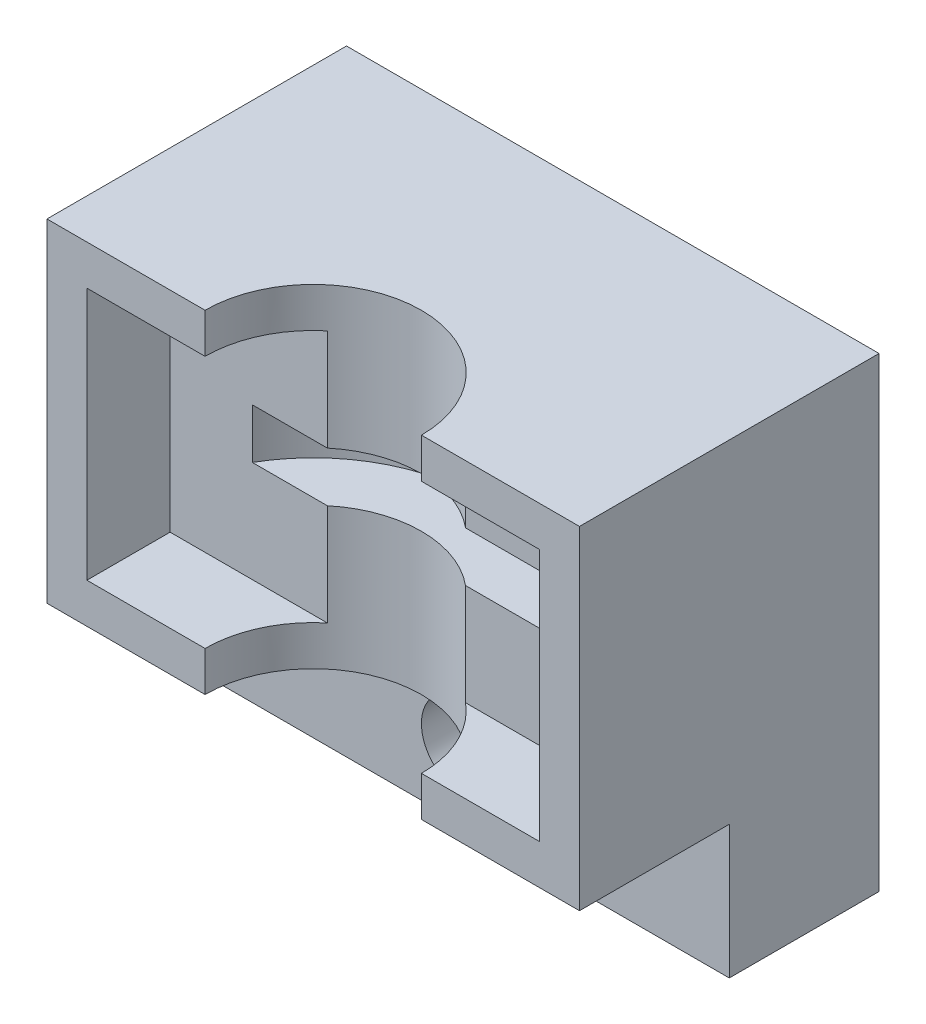
ISO-10303-21;
HEADER;
FILE_DESCRIPTION(('STEP AP214'),'2;1');
FILE_NAME('part.step','',(''),(''),'','','');
FILE_SCHEMA(('AUTOMOTIVE_DESIGN { 1 0 10303 214 1 1 1 1 }'));
ENDSEC;
DATA;
#1=APPLICATION_CONTEXT('core data for automotive mechanical design processes');
#2=APPLICATION_PROTOCOL_DEFINITION('international standard','automotive_design',2000,#1);
#3=PRODUCT_CONTEXT('',#1,'mechanical');
#4=PRODUCT('Part','Part','',(#3));
#5=PRODUCT_RELATED_PRODUCT_CATEGORY('part','',(#4));
#6=PRODUCT_DEFINITION_FORMATION('','',#4);
#7=PRODUCT_DEFINITION_CONTEXT('part definition',#1,'design');
#8=PRODUCT_DEFINITION('design','',#6,#7);
#9=PRODUCT_DEFINITION_SHAPE('','',#8);
#10=(LENGTH_UNIT() NAMED_UNIT(*) SI_UNIT(.MILLI.,.METRE.));
#11=(NAMED_UNIT(*) PLANE_ANGLE_UNIT() SI_UNIT($,.RADIAN.));
#12=(NAMED_UNIT(*) SI_UNIT($,.STERADIAN.) SOLID_ANGLE_UNIT());
#13=UNCERTAINTY_MEASURE_WITH_UNIT(LENGTH_MEASURE(1.E-05),#10,'distance_accuracy_value','');
#14=(GEOMETRIC_REPRESENTATION_CONTEXT(3) GLOBAL_UNCERTAINTY_ASSIGNED_CONTEXT((#13)) GLOBAL_UNIT_ASSIGNED_CONTEXT((#10,
#11,#12)) REPRESENTATION_CONTEXT('',''));
#15=CARTESIAN_POINT('',(0.,0.,0.));
#16=DIRECTION('',(0.,0.,1.));
#17=DIRECTION('',(1.,0.,0.));
#18=AXIS2_PLACEMENT_3D('',#15,#16,#17);
#19=CARTESIAN_POINT('',(0.,0.,90.));
#20=DIRECTION('',(0.,0.,1.));
#21=DIRECTION('',(1.,0.,0.));
#22=AXIS2_PLACEMENT_3D('',#19,#20,#21);
#23=PLANE('',#22);
#24=DIRECTION('',(-1.,0.,0.));
#25=VECTOR('',#24,1.);
#26=CARTESIAN_POINT('',(68.,58.,90.));
#27=LINE('',#26,#25);
#28=CARTESIAN_POINT('',(-32.5,58.,90.));
#29=VERTEX_POINT('',#28);
#30=CARTESIAN_POINT('',(-68.,58.,90.));
#31=VERTEX_POINT('',#30);
#32=EDGE_CURVE('E197',#29,#31,#27,.T.);
#33=ORIENTED_EDGE('',*,*,#32,.F.);
#34=DIRECTION('',(0.,-1.,0.));
#35=VECTOR('',#34,1.);
#36=CARTESIAN_POINT('',(-32.5,70.,90.));
#37=LINE('',#36,#35);
#38=CARTESIAN_POINT('',(-32.5,70.,90.));
#39=VERTEX_POINT('',#38);
#40=EDGE_CURVE('E292',#39,#29,#37,.T.);
#41=ORIENTED_EDGE('',*,*,#40,.F.);
#42=DIRECTION('',(-1.,0.,0.));
#43=VECTOR('',#42,1.);
#44=CARTESIAN_POINT('',(-80.,70.,90.));
#45=LINE('',#44,#43);
#46=CARTESIAN_POINT('',(-80.,70.,90.));
#47=VERTEX_POINT('',#46);
#48=EDGE_CURVE('E262',#39,#47,#45,.T.);
#49=ORIENTED_EDGE('',*,*,#48,.T.);
#50=DIRECTION('',(0.,-1.,0.));
#51=VECTOR('',#50,1.);
#52=CARTESIAN_POINT('',(-80.,70.,90.));
#53=LINE('',#52,#51);
#54=CARTESIAN_POINT('',(-80.,-30.,90.));
#55=VERTEX_POINT('',#54);
#56=EDGE_CURVE('E252',#47,#55,#53,.T.);
#57=ORIENTED_EDGE('',*,*,#56,.T.);
#58=DIRECTION('',(1.,0.,0.));
#59=VECTOR('',#58,1.);
#60=CARTESIAN_POINT('',(-80.,-30.,90.));
#61=LINE('',#60,#59);
#62=CARTESIAN_POINT('',(-32.5,-30.,90.));
#63=VERTEX_POINT('',#62);
#64=EDGE_CURVE('E256',#55,#63,#61,.T.);
#65=ORIENTED_EDGE('',*,*,#64,.T.);
#66=CARTESIAN_POINT('',(-32.5,-18.,90.));
#67=VERTEX_POINT('',#66);
#68=EDGE_CURVE('E290',#67,#63,#37,.T.);
#69=ORIENTED_EDGE('',*,*,#68,.F.);
#70=DIRECTION('',(1.,0.,0.));
#71=VECTOR('',#70,1.);
#72=CARTESIAN_POINT('',(68.,-18.,90.));
#73=LINE('',#72,#71);
#74=CARTESIAN_POINT('',(-68.,-18.,90.));
#75=VERTEX_POINT('',#74);
#76=EDGE_CURVE('E206',#75,#67,#73,.T.);
#77=ORIENTED_EDGE('',*,*,#76,.F.);
#78=DIRECTION('',(0.,-1.,0.));
#79=VECTOR('',#78,1.);
#80=CARTESIAN_POINT('',(-68.,58.,90.));
#81=LINE('',#80,#79);
#82=EDGE_CURVE('E178',#31,#75,#81,.T.);
#83=ORIENTED_EDGE('',*,*,#82,.F.);
#84=EDGE_LOOP('',(#33,#41,#49,#57,#65,#69,#77,#83));
#85=FACE_BOUND('',#84,.T.);
#86=ADVANCED_FACE('F33',(#85),#23,.T.);
#87=CARTESIAN_POINT('',(68.,58.,90.));
#88=VERTEX_POINT('',#87);
#89=CARTESIAN_POINT('',(32.5,58.,90.));
#90=VERTEX_POINT('',#89);
#91=EDGE_CURVE('E195',#88,#90,#27,.T.);
#92=ORIENTED_EDGE('',*,*,#91,.F.);
#93=DIRECTION('',(0.,1.,0.));
#94=VECTOR('',#93,1.);
#95=CARTESIAN_POINT('',(68.,58.,90.));
#96=LINE('',#95,#94);
#97=CARTESIAN_POINT('',(68.,-18.,90.));
#98=VERTEX_POINT('',#97);
#99=EDGE_CURVE('E208',#98,#88,#96,.T.);
#100=ORIENTED_EDGE('',*,*,#99,.F.);
#101=CARTESIAN_POINT('',(32.5,-18.,90.));
#102=VERTEX_POINT('',#101);
#103=EDGE_CURVE('E205',#102,#98,#73,.T.);
#104=ORIENTED_EDGE('',*,*,#103,.F.);
#105=DIRECTION('',(0.,-1.,0.));
#106=VECTOR('',#105,1.);
#107=CARTESIAN_POINT('',(32.5,70.,90.));
#108=LINE('',#107,#106);
#109=CARTESIAN_POINT('',(32.5,-30.,90.));
#110=VERTEX_POINT('',#109);
#111=EDGE_CURVE('E287',#110,#102,#108,.F.);
#112=ORIENTED_EDGE('',*,*,#111,.F.);
#113=CARTESIAN_POINT('',(80.,-30.,90.));
#114=VERTEX_POINT('',#113);
#115=EDGE_CURVE('E255',#110,#114,#61,.T.);
#116=ORIENTED_EDGE('',*,*,#115,.T.);
#117=DIRECTION('',(0.,1.,0.));
#118=VECTOR('',#117,1.);
#119=CARTESIAN_POINT('',(80.,70.,90.));
#120=LINE('',#119,#118);
#121=CARTESIAN_POINT('',(80.,70.,90.));
#122=VERTEX_POINT('',#121);
#123=EDGE_CURVE('E259',#114,#122,#120,.T.);
#124=ORIENTED_EDGE('',*,*,#123,.T.);
#125=CARTESIAN_POINT('',(32.5,70.,90.));
#126=VERTEX_POINT('',#125);
#127=EDGE_CURVE('E263',#122,#126,#45,.T.);
#128=ORIENTED_EDGE('',*,*,#127,.T.);
#129=EDGE_CURVE('E291',#90,#126,#108,.F.);
#130=ORIENTED_EDGE('',*,*,#129,.F.);
#131=EDGE_LOOP('',(#92,#100,#104,#112,#116,#124,#128,#130));
#132=FACE_BOUND('',#131,.T.);
#133=ADVANCED_FACE('F331',(#132),#23,.T.);
#134=CARTESIAN_POINT('',(0.,70.,90.));
#135=DIRECTION('',(0.,-1.,0.));
#136=DIRECTION('',(0.,0.,-1.));
#137=AXIS2_PLACEMENT_3D('',#134,#135,#136);
#138=CYLINDRICAL_SURFACE('',#137,32.5);
#139=DIRECTION('',(0.,-1.,0.));
#140=VECTOR('',#139,1.);
#141=CARTESIAN_POINT('',(20.7665596572952,70.,65.));
#142=LINE('',#141,#140);
#143=CARTESIAN_POINT('',(20.7665596572952,27.5,65.));
#144=VERTEX_POINT('',#143);
#145=CARTESIAN_POINT('',(20.7665596572952,58.,65.));
#146=VERTEX_POINT('',#145);
#147=EDGE_CURVE('E223',#144,#146,#142,.F.);
#148=ORIENTED_EDGE('',*,*,#147,.T.);
#149=CARTESIAN_POINT('',(0.,58.,90.));
#150=DIRECTION('',(0.,1.,0.));
#151=DIRECTION('',(0.,0.,1.));
#152=AXIS2_PLACEMENT_3D('',#149,#150,#151);
#153=CIRCLE('',#152,32.5);
#154=EDGE_CURVE('E11',#146,#90,#153,.F.);
#155=ORIENTED_EDGE('',*,*,#154,.T.);
#156=ORIENTED_EDGE('',*,*,#129,.T.);
#157=CARTESIAN_POINT('',(0.,70.,90.));
#158=DIRECTION('',(0.,-1.,0.));
#159=DIRECTION('',(0.,0.,-1.));
#160=AXIS2_PLACEMENT_3D('',#157,#158,#159);
#161=CIRCLE('',#160,32.5);
#162=EDGE_CURVE('E241',#39,#126,#161,.T.);
#163=ORIENTED_EDGE('',*,*,#162,.F.);
#164=ORIENTED_EDGE('',*,*,#40,.T.);
#165=CARTESIAN_POINT('',(-20.7665596572952,58.,65.));
#166=VERTEX_POINT('',#165);
#167=EDGE_CURVE('E37',#29,#166,#153,.F.);
#168=ORIENTED_EDGE('',*,*,#167,.T.);
#169=DIRECTION('',(0.,-1.,0.));
#170=VECTOR('',#169,1.);
#171=CARTESIAN_POINT('',(-20.7665596572952,70.,65.));
#172=LINE('',#171,#170);
#173=CARTESIAN_POINT('',(-20.7665596572952,27.5,65.));
#174=VERTEX_POINT('',#173);
#175=EDGE_CURVE('E231',#166,#174,#172,.T.);
#176=ORIENTED_EDGE('',*,*,#175,.T.);
#177=CARTESIAN_POINT('',(0.,27.5,90.));
#178=DIRECTION('',(0.,-1.,0.));
#179=DIRECTION('',(0.,0.,-1.));
#180=AXIS2_PLACEMENT_3D('',#177,#178,#179);
#181=CIRCLE('',#180,32.5);
#182=EDGE_CURVE('E298',#144,#174,#181,.F.);
#183=ORIENTED_EDGE('',*,*,#182,.F.);
#184=EDGE_LOOP('',(#148,#155,#156,#163,#164,#168,#176,#183));
#185=FACE_BOUND('',#184,.T.);
#186=ADVANCED_FACE('F328',(#185),#138,.F.);
#187=CARTESIAN_POINT('',(0.,0.,45.));
#188=DIRECTION('',(0.,0.,-1.));
#189=DIRECTION('',(-1.,0.,0.));
#190=AXIS2_PLACEMENT_3D('',#187,#188,#189);
#191=PLANE('',#190);
#192=CARTESIAN_POINT('',(0.,-50.,45.));
#193=DIRECTION('',(0.,0.,1.));
#194=DIRECTION('',(1.,0.,0.));
#195=AXIS2_PLACEMENT_3D('',#192,#193,#194);
#196=CIRCLE('',#195,12.5);
#197=CARTESIAN_POINT('',(12.5,-50.,45.));
#198=VERTEX_POINT('',#197);
#199=EDGE_CURVE('E244',#198,#198,#196,.T.);
#200=ORIENTED_EDGE('',*,*,#199,.F.);
#201=EDGE_LOOP('',(#200));
#202=FACE_BOUND('',#201,.T.);
#203=DIRECTION('',(1.,0.,0.));
#204=VECTOR('',#203,1.);
#205=CARTESIAN_POINT('',(-80.,-30.,45.));
#206=LINE('',#205,#204);
#207=CARTESIAN_POINT('',(-80.,-30.,45.));
#208=VERTEX_POINT('',#207);
#209=CARTESIAN_POINT('',(80.,-30.,45.));
#210=VERTEX_POINT('',#209);
#211=EDGE_CURVE('E249',#208,#210,#206,.T.);
#212=ORIENTED_EDGE('',*,*,#211,.F.);
#213=DIRECTION('',(0.,-1.,0.));
#214=VECTOR('',#213,1.);
#215=CARTESIAN_POINT('',(-80.,-70.,45.));
#216=LINE('',#215,#214);
#217=CARTESIAN_POINT('',(-80.,-70.,45.));
#218=VERTEX_POINT('',#217);
#219=EDGE_CURVE('E275',#208,#218,#216,.T.);
#220=ORIENTED_EDGE('',*,*,#219,.T.);
#221=DIRECTION('',(1.,0.,0.));
#222=VECTOR('',#221,1.);
#223=CARTESIAN_POINT('',(-80.,-70.,45.));
#224=LINE('',#223,#222);
#225=CARTESIAN_POINT('',(80.,-70.,45.));
#226=VERTEX_POINT('',#225);
#227=EDGE_CURVE('E347',#218,#226,#224,.T.);
#228=ORIENTED_EDGE('',*,*,#227,.T.);
#229=DIRECTION('',(0.,1.,0.));
#230=VECTOR('',#229,1.);
#231=CARTESIAN_POINT('',(80.,-70.,45.));
#232=LINE('',#231,#230);
#233=EDGE_CURVE('E343',#226,#210,#232,.T.);
#234=ORIENTED_EDGE('',*,*,#233,.T.);
#235=EDGE_LOOP('',(#212,#220,#228,#234));
#236=FACE_BOUND('',#235,.T.);
#237=ADVANCED_FACE('F373',(#202,#236),#191,.F.);
#238=CARTESIAN_POINT('',(80.,-70.,45.));
#239=DIRECTION('',(-1.,0.,0.));
#240=DIRECTION('',(0.,0.,1.));
#241=AXIS2_PLACEMENT_3D('',#238,#239,#240);
#242=PLANE('',#241);
#243=DIRECTION('',(0.,1.,0.));
#244=VECTOR('',#243,1.);
#245=CARTESIAN_POINT('',(80.,-70.,0.));
#246=LINE('',#245,#244);
#247=CARTESIAN_POINT('',(80.,-70.,0.));
#248=VERTEX_POINT('',#247);
#249=CARTESIAN_POINT('',(80.,70.,0.));
#250=VERTEX_POINT('',#249);
#251=EDGE_CURVE('E284',#248,#250,#246,.T.);
#252=ORIENTED_EDGE('',*,*,#251,.T.);
#253=DIRECTION('',(0.,0.,-1.));
#254=VECTOR('',#253,1.);
#255=CARTESIAN_POINT('',(80.,70.,45.));
#256=LINE('',#255,#254);
#257=EDGE_CURVE('E333',#122,#250,#256,.T.);
#258=ORIENTED_EDGE('',*,*,#257,.F.);
#259=ORIENTED_EDGE('',*,*,#123,.F.);
#260=DIRECTION('',(0.,0.,-1.));
#261=VECTOR('',#260,1.);
#262=CARTESIAN_POINT('',(80.,-30.,90.));
#263=LINE('',#262,#261);
#264=EDGE_CURVE('E266',#114,#210,#263,.T.);
#265=ORIENTED_EDGE('',*,*,#264,.T.);
#266=ORIENTED_EDGE('',*,*,#233,.F.);
#267=DIRECTION('',(0.,0.,-1.));
#268=VECTOR('',#267,1.);
#269=CARTESIAN_POINT('',(80.,-70.,45.));
#270=LINE('',#269,#268);
#271=EDGE_CURVE('E359',#226,#248,#270,.T.);
#272=ORIENTED_EDGE('',*,*,#271,.T.);
#273=EDGE_LOOP('',(#252,#258,#259,#265,#266,#272));
#274=FACE_BOUND('',#273,.T.);
#275=ADVANCED_FACE('F35',(#274),#242,.F.);
#276=CARTESIAN_POINT('',(-80.,70.,45.));
#277=DIRECTION('',(0.,-1.,0.));
#278=DIRECTION('',(0.,0.,-1.));
#279=AXIS2_PLACEMENT_3D('',#276,#277,#278);
#280=PLANE('',#279);
#281=ORIENTED_EDGE('',*,*,#48,.F.);
#282=ORIENTED_EDGE('',*,*,#162,.T.);
#283=ORIENTED_EDGE('',*,*,#127,.F.);
#284=ORIENTED_EDGE('',*,*,#257,.T.);
#285=DIRECTION('',(-1.,0.,0.));
#286=VECTOR('',#285,1.);
#287=CARTESIAN_POINT('',(-80.,70.,0.));
#288=LINE('',#287,#286);
#289=CARTESIAN_POINT('',(-80.,70.,0.));
#290=VERTEX_POINT('',#289);
#291=EDGE_CURVE('E355',#250,#290,#288,.T.);
#292=ORIENTED_EDGE('',*,*,#291,.T.);
#293=DIRECTION('',(0.,0.,-1.));
#294=VECTOR('',#293,1.);
#295=CARTESIAN_POINT('',(-80.,70.,45.));
#296=LINE('',#295,#294);
#297=EDGE_CURVE('E335',#47,#290,#296,.T.);
#298=ORIENTED_EDGE('',*,*,#297,.F.);
#299=EDGE_LOOP('',(#281,#282,#283,#284,#292,#298));
#300=FACE_BOUND('',#299,.T.);
#301=ADVANCED_FACE('F388',(#300),#280,.F.);
#302=CARTESIAN_POINT('',(-80.,-70.,45.));
#303=DIRECTION('',(1.,0.,0.));
#304=DIRECTION('',(0.,0.,-1.));
#305=AXIS2_PLACEMENT_3D('',#302,#303,#304);
#306=PLANE('',#305);
#307=DIRECTION('',(0.,-1.,0.));
#308=VECTOR('',#307,1.);
#309=CARTESIAN_POINT('',(-80.,-70.,0.));
#310=LINE('',#309,#308);
#311=CARTESIAN_POINT('',(-80.,-70.,0.));
#312=VERTEX_POINT('',#311);
#313=EDGE_CURVE('E348',#290,#312,#310,.T.);
#314=ORIENTED_EDGE('',*,*,#313,.T.);
#315=DIRECTION('',(0.,0.,-1.));
#316=VECTOR('',#315,1.);
#317=CARTESIAN_POINT('',(-80.,-70.,45.));
#318=LINE('',#317,#316);
#319=EDGE_CURVE('E340',#218,#312,#318,.T.);
#320=ORIENTED_EDGE('',*,*,#319,.F.);
#321=ORIENTED_EDGE('',*,*,#219,.F.);
#322=DIRECTION('',(0.,0.,-1.));
#323=VECTOR('',#322,1.);
#324=CARTESIAN_POINT('',(-80.,-30.,90.));
#325=LINE('',#324,#323);
#326=EDGE_CURVE('E279',#55,#208,#325,.T.);
#327=ORIENTED_EDGE('',*,*,#326,.F.);
#328=ORIENTED_EDGE('',*,*,#56,.F.);
#329=ORIENTED_EDGE('',*,*,#297,.T.);
#330=EDGE_LOOP('',(#314,#320,#321,#327,#328,#329));
#331=FACE_BOUND('',#330,.T.);
#332=ADVANCED_FACE('F381',(#331),#306,.F.);
#333=CARTESIAN_POINT('',(-80.,-70.,45.));
#334=DIRECTION('',(0.,1.,0.));
#335=DIRECTION('',(0.,0.,1.));
#336=AXIS2_PLACEMENT_3D('',#333,#334,#335);
#337=PLANE('',#336);
#338=DIRECTION('',(1.,0.,0.));
#339=VECTOR('',#338,1.);
#340=CARTESIAN_POINT('',(-80.,-70.,0.));
#341=LINE('',#340,#339);
#342=EDGE_CURVE('E344',#312,#248,#341,.T.);
#343=ORIENTED_EDGE('',*,*,#342,.T.);
#344=ORIENTED_EDGE('',*,*,#271,.F.);
#345=ORIENTED_EDGE('',*,*,#227,.F.);
#346=ORIENTED_EDGE('',*,*,#319,.T.);
#347=EDGE_LOOP('',(#343,#344,#345,#346));
#348=FACE_BOUND('',#347,.T.);
#349=ADVANCED_FACE('F362',(#348),#337,.F.);
#350=CARTESIAN_POINT('',(0.,0.,0.));
#351=DIRECTION('',(0.,0.,-1.));
#352=DIRECTION('',(-1.,0.,0.));
#353=AXIS2_PLACEMENT_3D('',#350,#351,#352);
#354=PLANE('',#353);
#355=CARTESIAN_POINT('',(0.,-50.,0.));
#356=DIRECTION('',(0.,0.,1.));
#357=DIRECTION('',(1.,0.,0.));
#358=AXIS2_PLACEMENT_3D('',#355,#356,#357);
#359=CIRCLE('',#358,12.5);
#360=CARTESIAN_POINT('',(12.5,-50.,0.));
#361=VERTEX_POINT('',#360);
#362=EDGE_CURVE('E246',#361,#361,#359,.T.);
#363=ORIENTED_EDGE('',*,*,#362,.T.);
#364=EDGE_LOOP('',(#363));
#365=FACE_BOUND('',#364,.T.);
#366=ORIENTED_EDGE('',*,*,#251,.F.);
#367=ORIENTED_EDGE('',*,*,#342,.F.);
#368=ORIENTED_EDGE('',*,*,#313,.F.);
#369=ORIENTED_EDGE('',*,*,#291,.F.);
#370=EDGE_LOOP('',(#366,#367,#368,#369));
#371=FACE_BOUND('',#370,.T.);
#372=ADVANCED_FACE('F368',(#365,#371),#354,.T.);
#373=CARTESIAN_POINT('',(-80.,-30.,90.));
#374=DIRECTION('',(0.,1.,0.));
#375=DIRECTION('',(0.,0.,1.));
#376=AXIS2_PLACEMENT_3D('',#373,#374,#375);
#377=PLANE('',#376);
#378=ORIENTED_EDGE('',*,*,#115,.F.);
#379=CARTESIAN_POINT('',(0.,-30.,90.));
#380=DIRECTION('',(0.,-1.,0.));
#381=DIRECTION('',(0.,0.,-1.));
#382=AXIS2_PLACEMENT_3D('',#379,#380,#381);
#383=CIRCLE('',#382,32.5);
#384=EDGE_CURVE('E238',#63,#110,#383,.T.);
#385=ORIENTED_EDGE('',*,*,#384,.F.);
#386=ORIENTED_EDGE('',*,*,#64,.F.);
#387=ORIENTED_EDGE('',*,*,#326,.T.);
#388=ORIENTED_EDGE('',*,*,#211,.T.);
#389=ORIENTED_EDGE('',*,*,#264,.F.);
#390=EDGE_LOOP('',(#378,#385,#386,#387,#388,#389));
#391=FACE_BOUND('',#390,.T.);
#392=ADVANCED_FACE('F378',(#391),#377,.F.);
#393=CARTESIAN_POINT('',(0.,-50.,0.));
#394=DIRECTION('',(0.,0.,1.));
#395=DIRECTION('',(1.,0.,0.));
#396=AXIS2_PLACEMENT_3D('',#393,#394,#395);
#397=CYLINDRICAL_SURFACE('',#396,12.5);
#398=CARTESIAN_POINT('',(12.5,-50.,0.));
#399=CARTESIAN_POINT('',(12.5,-50.,0.468749999999999));
#400=CARTESIAN_POINT('',(12.5,-50.,0.9375));
#401=CARTESIAN_POINT('',(12.5,-50.,1.875));
#402=CARTESIAN_POINT('',(12.5,-50.,2.34375));
#403=CARTESIAN_POINT('',(12.5,-50.,3.28125));
#404=CARTESIAN_POINT('',(12.5,-50.,3.75));
#405=CARTESIAN_POINT('',(12.5,-50.,4.6875));
#406=CARTESIAN_POINT('',(12.5,-50.,5.15625));
#407=CARTESIAN_POINT('',(12.5,-50.,6.09375));
#408=CARTESIAN_POINT('',(12.5,-50.,6.5625));
#409=CARTESIAN_POINT('',(12.5,-50.,7.5));
#410=CARTESIAN_POINT('',(12.5,-50.,7.96875));
#411=CARTESIAN_POINT('',(12.5,-50.,8.90625));
#412=CARTESIAN_POINT('',(12.5,-50.,9.375));
#413=CARTESIAN_POINT('',(12.5,-50.,10.3125));
#414=CARTESIAN_POINT('',(12.5,-50.,10.78125));
#415=CARTESIAN_POINT('',(12.5,-50.,11.71875));
#416=CARTESIAN_POINT('',(12.5,-50.,12.1875));
#417=CARTESIAN_POINT('',(12.5,-50.,13.125));
#418=CARTESIAN_POINT('',(12.5,-50.,13.59375));
#419=CARTESIAN_POINT('',(12.5,-50.,14.53125));
#420=CARTESIAN_POINT('',(12.5,-50.,15.));
#421=CARTESIAN_POINT('',(12.5,-50.,15.9375));
#422=CARTESIAN_POINT('',(12.5,-50.,16.40625));
#423=CARTESIAN_POINT('',(12.5,-50.,17.34375));
#424=CARTESIAN_POINT('',(12.5,-50.,17.8125));
#425=CARTESIAN_POINT('',(12.5,-50.,18.75));
#426=CARTESIAN_POINT('',(12.5,-50.,19.21875));
#427=CARTESIAN_POINT('',(12.5,-50.,20.15625));
#428=CARTESIAN_POINT('',(12.5,-50.,20.625));
#429=CARTESIAN_POINT('',(12.5,-50.,21.5625));
#430=CARTESIAN_POINT('',(12.5,-50.,22.03125));
#431=CARTESIAN_POINT('',(12.5,-50.,22.96875));
#432=CARTESIAN_POINT('',(12.5,-50.,23.4375));
#433=CARTESIAN_POINT('',(12.5,-50.,24.375));
#434=CARTESIAN_POINT('',(12.5,-50.,24.84375));
#435=CARTESIAN_POINT('',(12.5,-50.,25.78125));
#436=CARTESIAN_POINT('',(12.5,-50.,26.25));
#437=CARTESIAN_POINT('',(12.5,-50.,27.1875));
#438=CARTESIAN_POINT('',(12.5,-50.,27.65625));
#439=CARTESIAN_POINT('',(12.5,-50.,28.59375));
#440=CARTESIAN_POINT('',(12.5,-50.,29.0625));
#441=CARTESIAN_POINT('',(12.5,-50.,30.));
#442=CARTESIAN_POINT('',(12.5,-50.,30.46875));
#443=CARTESIAN_POINT('',(12.5,-50.,31.40625));
#444=CARTESIAN_POINT('',(12.5,-50.,31.875));
#445=CARTESIAN_POINT('',(12.5,-50.,32.8125));
#446=CARTESIAN_POINT('',(12.5,-50.,33.28125));
#447=CARTESIAN_POINT('',(12.5,-50.,34.21875));
#448=CARTESIAN_POINT('',(12.5,-50.,34.6875));
#449=CARTESIAN_POINT('',(12.5,-50.,35.625));
#450=CARTESIAN_POINT('',(12.5,-50.,36.09375));
#451=CARTESIAN_POINT('',(12.5,-50.,37.03125));
#452=CARTESIAN_POINT('',(12.5,-50.,37.5));
#453=CARTESIAN_POINT('',(12.5,-50.,38.4375));
#454=CARTESIAN_POINT('',(12.5,-50.,38.90625));
#455=CARTESIAN_POINT('',(12.5,-50.,39.84375));
#456=CARTESIAN_POINT('',(12.5,-50.,40.3125));
#457=CARTESIAN_POINT('',(12.5,-50.,41.25));
#458=CARTESIAN_POINT('',(12.5,-50.,41.71875));
#459=CARTESIAN_POINT('',(12.5,-50.,42.65625));
#460=CARTESIAN_POINT('',(12.5,-50.,43.125));
#461=CARTESIAN_POINT('',(12.5,-50.,44.0625));
#462=CARTESIAN_POINT('',(12.5,-50.,44.53125));
#463=CARTESIAN_POINT('',(12.5,-50.,45.));
#464=B_SPLINE_CURVE_WITH_KNOTS('',3,(#398,#399,#400,#401,#402,#403,#404,#405,#406,#407,#408,
#409,#410,#411,#412,#413,#414,#415,#416,#417,#418,#419,#420,#421,#422,#423,#424,#425,#426,#427,
#428,#429,#430,#431,#432,#433,#434,#435,#436,#437,#438,#439,#440,#441,#442,#443,#444,#445,#446,
#447,#448,#449,#450,#451,#452,#453,#454,#455,#456,#457,#458,#459,#460,#461,#462,#463),
.UNSPECIFIED.,.F.,.F.,(4,2,2,2,2,2,2,2,2,2,2,2,2,2,2,2,2,2,2,2,2,2,2,2,2,2,2,2,2,2,2,2,4),(0.,
1.40625,2.8125,4.21875,5.625,7.03125,8.4375,9.84375,11.25,12.65625,14.0625,15.46875,16.875,
18.28125,19.6875,21.09375,22.5,23.90625,25.3125,26.71875,28.125,29.53125,30.9375,32.34375,33.75,
35.15625,36.5625,37.96875,39.375,40.78125,42.1875,43.59375,45.),.UNSPECIFIED.);
#465=EDGE_CURVE('BSEAM402',#361,#198,#464,.T.);
#466=ORIENTED_EDGE('',*,*,#362,.F.);
#467=ORIENTED_EDGE('',*,*,#199,.T.);
#468=ORIENTED_EDGE('',*,*,#465,.T.);
#469=ORIENTED_EDGE('',*,*,#465,.F.);
#470=EDGE_LOOP('',(#466,#468,#467,#469));
#471=FACE_BOUND('',#470,.T.);
#472=ADVANCED_FACE('F402',(#471),#397,.F.);
#473=ORIENTED_EDGE('',*,*,#111,.T.);
#474=CARTESIAN_POINT('',(0.,-18.,90.));
#475=DIRECTION('',(0.,-1.,0.));
#476=DIRECTION('',(0.,0.,-1.));
#477=AXIS2_PLACEMENT_3D('',#474,#475,#476);
#478=CIRCLE('',#477,32.5);
#479=CARTESIAN_POINT('',(20.7665596572952,-18.,65.));
#480=VERTEX_POINT('',#479);
#481=EDGE_CURVE('E303',#102,#480,#478,.F.);
#482=ORIENTED_EDGE('',*,*,#481,.T.);
#483=DIRECTION('',(0.,-1.,0.));
#484=VECTOR('',#483,1.);
#485=CARTESIAN_POINT('',(20.7665596572952,70.,65.));
#486=LINE('',#485,#484);
#487=CARTESIAN_POINT('',(20.7665596572952,12.5,65.));
#488=VERTEX_POINT('',#487);
#489=EDGE_CURVE('E218',#480,#488,#486,.F.);
#490=ORIENTED_EDGE('',*,*,#489,.T.);
#491=CARTESIAN_POINT('',(0.,12.5,90.));
#492=DIRECTION('',(0.,-1.,0.));
#493=DIRECTION('',(0.,0.,-1.));
#494=AXIS2_PLACEMENT_3D('',#491,#492,#493);
#495=CIRCLE('',#494,32.5);
#496=CARTESIAN_POINT('',(-20.7665596572952,12.5,65.));
#497=VERTEX_POINT('',#496);
#498=EDGE_CURVE('E295',#488,#497,#495,.F.);
#499=ORIENTED_EDGE('',*,*,#498,.T.);
#500=DIRECTION('',(0.,-1.,0.));
#501=VECTOR('',#500,1.);
#502=CARTESIAN_POINT('',(-20.7665596572952,70.,65.));
#503=LINE('',#502,#501);
#504=CARTESIAN_POINT('',(-20.7665596572952,-18.,65.));
#505=VERTEX_POINT('',#504);
#506=EDGE_CURVE('E56',#497,#505,#503,.T.);
#507=ORIENTED_EDGE('',*,*,#506,.T.);
#508=EDGE_CURVE('E187',#505,#67,#478,.F.);
#509=ORIENTED_EDGE('',*,*,#508,.T.);
#510=ORIENTED_EDGE('',*,*,#68,.T.);
#511=ORIENTED_EDGE('',*,*,#384,.T.);
#512=EDGE_LOOP('',(#473,#482,#490,#499,#507,#509,#510,#511));
#513=FACE_BOUND('',#512,.T.);
#514=ADVANCED_FACE('F311',(#513),#138,.F.);
#515=CARTESIAN_POINT('',(0.,27.5,90.));
#516=DIRECTION('',(0.,-1.,0.));
#517=DIRECTION('',(0.,0.,-1.));
#518=AXIS2_PLACEMENT_3D('',#515,#516,#517);
#519=CYLINDRICAL_SURFACE('',#518,50.);
#520=CARTESIAN_POINT('',(0.,12.5,90.));
#521=DIRECTION('',(0.,-1.,0.));
#522=DIRECTION('',(0.,0.,-1.));
#523=AXIS2_PLACEMENT_3D('',#520,#521,#522);
#524=CIRCLE('',#523,50.);
#525=CARTESIAN_POINT('',(-43.3012701892219,12.5,65.));
#526=VERTEX_POINT('',#525);
#527=CARTESIAN_POINT('',(43.3012701892219,12.5,65.));
#528=VERTEX_POINT('',#527);
#529=EDGE_CURVE('E234',#526,#528,#524,.T.);
#530=ORIENTED_EDGE('',*,*,#529,.T.);
#531=DIRECTION('',(0.,-1.,0.));
#532=VECTOR('',#531,1.);
#533=CARTESIAN_POINT('',(43.3012701892219,27.5,65.));
#534=LINE('',#533,#532);
#535=CARTESIAN_POINT('',(43.3012701892219,27.5,65.));
#536=VERTEX_POINT('',#535);
#537=EDGE_CURVE('E48',#528,#536,#534,.F.);
#538=ORIENTED_EDGE('',*,*,#537,.T.);
#539=CARTESIAN_POINT('',(0.,27.5,90.));
#540=DIRECTION('',(0.,-1.,0.));
#541=DIRECTION('',(0.,0.,-1.));
#542=AXIS2_PLACEMENT_3D('',#539,#540,#541);
#543=CIRCLE('',#542,50.);
#544=CARTESIAN_POINT('',(-43.3012701892219,27.5,65.));
#545=VERTEX_POINT('',#544);
#546=EDGE_CURVE('E235',#545,#536,#543,.T.);
#547=ORIENTED_EDGE('',*,*,#546,.F.);
#548=DIRECTION('',(0.,-1.,0.));
#549=VECTOR('',#548,1.);
#550=CARTESIAN_POINT('',(-43.3012701892219,27.5,65.));
#551=LINE('',#550,#549);
#552=EDGE_CURVE('E227',#545,#526,#551,.T.);
#553=ORIENTED_EDGE('',*,*,#552,.T.);
#554=EDGE_LOOP('',(#530,#538,#547,#553));
#555=FACE_BOUND('',#554,.T.);
#556=ADVANCED_FACE('F439',(#555),#519,.F.);
#557=CARTESIAN_POINT('',(0.,27.5,90.));
#558=DIRECTION('',(0.,-1.,0.));
#559=DIRECTION('',(0.,0.,-1.));
#560=AXIS2_PLACEMENT_3D('',#557,#558,#559);
#561=PLANE('',#560);
#562=DIRECTION('',(1.,0.,0.));
#563=VECTOR('',#562,1.);
#564=CARTESIAN_POINT('',(0.,27.5,65.));
#565=LINE('',#564,#563);
#566=EDGE_CURVE('E224',#545,#174,#565,.T.);
#567=ORIENTED_EDGE('',*,*,#566,.F.);
#568=ORIENTED_EDGE('',*,*,#546,.T.);
#569=EDGE_CURVE('E221',#144,#536,#565,.T.);
#570=ORIENTED_EDGE('',*,*,#569,.F.);
#571=ORIENTED_EDGE('',*,*,#182,.T.);
#572=EDGE_LOOP('',(#567,#568,#570,#571));
#573=FACE_BOUND('',#572,.T.);
#574=ADVANCED_FACE('F446',(#573),#561,.T.);
#575=CARTESIAN_POINT('',(0.,12.5,90.));
#576=DIRECTION('',(0.,-1.,0.));
#577=DIRECTION('',(0.,0.,-1.));
#578=AXIS2_PLACEMENT_3D('',#575,#576,#577);
#579=PLANE('',#578);
#580=ORIENTED_EDGE('',*,*,#529,.F.);
#581=DIRECTION('',(1.,0.,0.));
#582=VECTOR('',#581,1.);
#583=CARTESIAN_POINT('',(0.,12.5,65.));
#584=LINE('',#583,#582);
#585=EDGE_CURVE('E302',#526,#497,#584,.T.);
#586=ORIENTED_EDGE('',*,*,#585,.T.);
#587=ORIENTED_EDGE('',*,*,#498,.F.);
#588=EDGE_CURVE('E301',#488,#528,#584,.T.);
#589=ORIENTED_EDGE('',*,*,#588,.T.);
#590=EDGE_LOOP('',(#580,#586,#587,#589));
#591=FACE_BOUND('',#590,.T.);
#592=ADVANCED_FACE('F310',(#591),#579,.F.);
#593=CARTESIAN_POINT('',(0.,0.,65.));
#594=DIRECTION('',(0.,0.,-1.));
#595=DIRECTION('',(-1.,0.,0.));
#596=AXIS2_PLACEMENT_3D('',#593,#594,#595);
#597=PLANE('',#596);
#598=ORIENTED_EDGE('',*,*,#569,.T.);
#599=ORIENTED_EDGE('',*,*,#537,.F.);
#600=ORIENTED_EDGE('',*,*,#588,.F.);
#601=ORIENTED_EDGE('',*,*,#489,.F.);
#602=DIRECTION('',(1.,0.,0.));
#603=VECTOR('',#602,1.);
#604=CARTESIAN_POINT('',(68.,-18.,65.));
#605=LINE('',#604,#603);
#606=CARTESIAN_POINT('',(68.,-18.,65.));
#607=VERTEX_POINT('',#606);
#608=EDGE_CURVE('E189',#480,#607,#605,.T.);
#609=ORIENTED_EDGE('',*,*,#608,.T.);
#610=DIRECTION('',(0.,1.,0.));
#611=VECTOR('',#610,1.);
#612=CARTESIAN_POINT('',(68.,58.,65.));
#613=LINE('',#612,#611);
#614=CARTESIAN_POINT('',(68.,58.,65.));
#615=VERTEX_POINT('',#614);
#616=EDGE_CURVE('E188',#607,#615,#613,.T.);
#617=ORIENTED_EDGE('',*,*,#616,.T.);
#618=DIRECTION('',(-1.,0.,0.));
#619=VECTOR('',#618,1.);
#620=CARTESIAN_POINT('',(68.,58.,65.));
#621=LINE('',#620,#619);
#622=EDGE_CURVE('E182',#615,#146,#621,.T.);
#623=ORIENTED_EDGE('',*,*,#622,.T.);
#624=ORIENTED_EDGE('',*,*,#147,.F.);
#625=EDGE_LOOP('',(#598,#599,#600,#601,#609,#617,#623,#624));
#626=FACE_BOUND('',#625,.T.);
#627=ADVANCED_FACE('F313',(#626),#597,.F.);
#628=CARTESIAN_POINT('',(68.,-18.,65.));
#629=DIRECTION('',(0.,-1.,0.));
#630=DIRECTION('',(0.,0.,-1.));
#631=AXIS2_PLACEMENT_3D('',#628,#629,#630);
#632=PLANE('',#631);
#633=ORIENTED_EDGE('',*,*,#103,.T.);
#634=DIRECTION('',(0.,0.,1.));
#635=VECTOR('',#634,1.);
#636=CARTESIAN_POINT('',(68.,-18.,65.));
#637=LINE('',#636,#635);
#638=EDGE_CURVE('E181',#607,#98,#637,.T.);
#639=ORIENTED_EDGE('',*,*,#638,.F.);
#640=ORIENTED_EDGE('',*,*,#608,.F.);
#641=ORIENTED_EDGE('',*,*,#481,.F.);
#642=EDGE_LOOP('',(#633,#639,#640,#641));
#643=FACE_BOUND('',#642,.T.);
#644=ADVANCED_FACE('F316',(#643),#632,.F.);
#645=CARTESIAN_POINT('',(68.,58.,65.));
#646=DIRECTION('',(0.,1.,0.));
#647=DIRECTION('',(0.,0.,1.));
#648=AXIS2_PLACEMENT_3D('',#645,#646,#647);
#649=PLANE('',#648);
#650=ORIENTED_EDGE('',*,*,#622,.F.);
#651=DIRECTION('',(0.,0.,1.));
#652=VECTOR('',#651,1.);
#653=CARTESIAN_POINT('',(68.,58.,65.));
#654=LINE('',#653,#652);
#655=EDGE_CURVE('E213',#615,#88,#654,.T.);
#656=ORIENTED_EDGE('',*,*,#655,.T.);
#657=ORIENTED_EDGE('',*,*,#91,.T.);
#658=ORIENTED_EDGE('',*,*,#154,.F.);
#659=EDGE_LOOP('',(#650,#656,#657,#658));
#660=FACE_BOUND('',#659,.T.);
#661=ADVANCED_FACE('F324',(#660),#649,.F.);
#662=CARTESIAN_POINT('',(68.,58.,65.));
#663=DIRECTION('',(1.,0.,0.));
#664=DIRECTION('',(0.,1.,0.));
#665=AXIS2_PLACEMENT_3D('',#662,#663,#664);
#666=PLANE('',#665);
#667=ORIENTED_EDGE('',*,*,#99,.T.);
#668=ORIENTED_EDGE('',*,*,#655,.F.);
#669=ORIENTED_EDGE('',*,*,#616,.F.);
#670=ORIENTED_EDGE('',*,*,#638,.T.);
#671=EDGE_LOOP('',(#667,#668,#669,#670));
#672=FACE_BOUND('',#671,.T.);
#673=ADVANCED_FACE('F321',(#672),#666,.F.);
#674=ORIENTED_EDGE('',*,*,#32,.T.);
#675=DIRECTION('',(0.,0.,1.));
#676=VECTOR('',#675,1.);
#677=CARTESIAN_POINT('',(-68.,58.,65.));
#678=LINE('',#677,#676);
#679=CARTESIAN_POINT('',(-68.,58.,65.));
#680=VERTEX_POINT('',#679);
#681=EDGE_CURVE('E211',#680,#31,#678,.T.);
#682=ORIENTED_EDGE('',*,*,#681,.F.);
#683=EDGE_CURVE('E193',#166,#680,#621,.T.);
#684=ORIENTED_EDGE('',*,*,#683,.F.);
#685=ORIENTED_EDGE('',*,*,#167,.F.);
#686=EDGE_LOOP('',(#674,#682,#684,#685));
#687=FACE_BOUND('',#686,.T.);
#688=ADVANCED_FACE('F480',(#687),#649,.F.);
#689=CARTESIAN_POINT('',(-68.,-18.,65.));
#690=VERTEX_POINT('',#689);
#691=EDGE_CURVE('E184',#690,#505,#605,.T.);
#692=ORIENTED_EDGE('',*,*,#691,.F.);
#693=DIRECTION('',(0.,0.,1.));
#694=VECTOR('',#693,1.);
#695=CARTESIAN_POINT('',(-68.,-18.,65.));
#696=LINE('',#695,#694);
#697=EDGE_CURVE('E171',#690,#75,#696,.T.);
#698=ORIENTED_EDGE('',*,*,#697,.T.);
#699=ORIENTED_EDGE('',*,*,#76,.T.);
#700=ORIENTED_EDGE('',*,*,#508,.F.);
#701=EDGE_LOOP('',(#692,#698,#699,#700));
#702=FACE_BOUND('',#701,.T.);
#703=ADVANCED_FACE('F185',(#702),#632,.F.);
#704=ORIENTED_EDGE('',*,*,#683,.T.);
#705=DIRECTION('',(0.,-1.,0.));
#706=VECTOR('',#705,1.);
#707=CARTESIAN_POINT('',(-68.,58.,65.));
#708=LINE('',#707,#706);
#709=EDGE_CURVE('E176',#680,#690,#708,.T.);
#710=ORIENTED_EDGE('',*,*,#709,.T.);
#711=ORIENTED_EDGE('',*,*,#691,.T.);
#712=ORIENTED_EDGE('',*,*,#506,.F.);
#713=ORIENTED_EDGE('',*,*,#585,.F.);
#714=ORIENTED_EDGE('',*,*,#552,.F.);
#715=ORIENTED_EDGE('',*,*,#566,.T.);
#716=ORIENTED_EDGE('',*,*,#175,.F.);
#717=EDGE_LOOP('',(#704,#710,#711,#712,#713,#714,#715,#716));
#718=FACE_BOUND('',#717,.T.);
#719=ADVANCED_FACE('F191',(#718),#597,.F.);
#720=CARTESIAN_POINT('',(-68.,58.,65.));
#721=DIRECTION('',(-1.,0.,0.));
#722=DIRECTION('',(0.,-1.,0.));
#723=AXIS2_PLACEMENT_3D('',#720,#721,#722);
#724=PLANE('',#723);
#725=ORIENTED_EDGE('',*,*,#82,.T.);
#726=ORIENTED_EDGE('',*,*,#697,.F.);
#727=ORIENTED_EDGE('',*,*,#709,.F.);
#728=ORIENTED_EDGE('',*,*,#681,.T.);
#729=EDGE_LOOP('',(#725,#726,#727,#728));
#730=FACE_BOUND('',#729,.T.);
#731=ADVANCED_FACE('F173',(#730),#724,.F.);
#732=CLOSED_SHELL('',(#86,#133,#186,#237,#275,#301,#332,#349,#372,#392,#472,#514,#556,#574,#592,
#627,#644,#661,#673,#688,#703,#719,#731));
#733=MANIFOLD_SOLID_BREP('B2',#732);
#734=ADVANCED_BREP_SHAPE_REPRESENTATION('',(#18,#733),#14);
#735=SHAPE_DEFINITION_REPRESENTATION(#9,#734);
ENDSEC;
END-ISO-10303-21;
